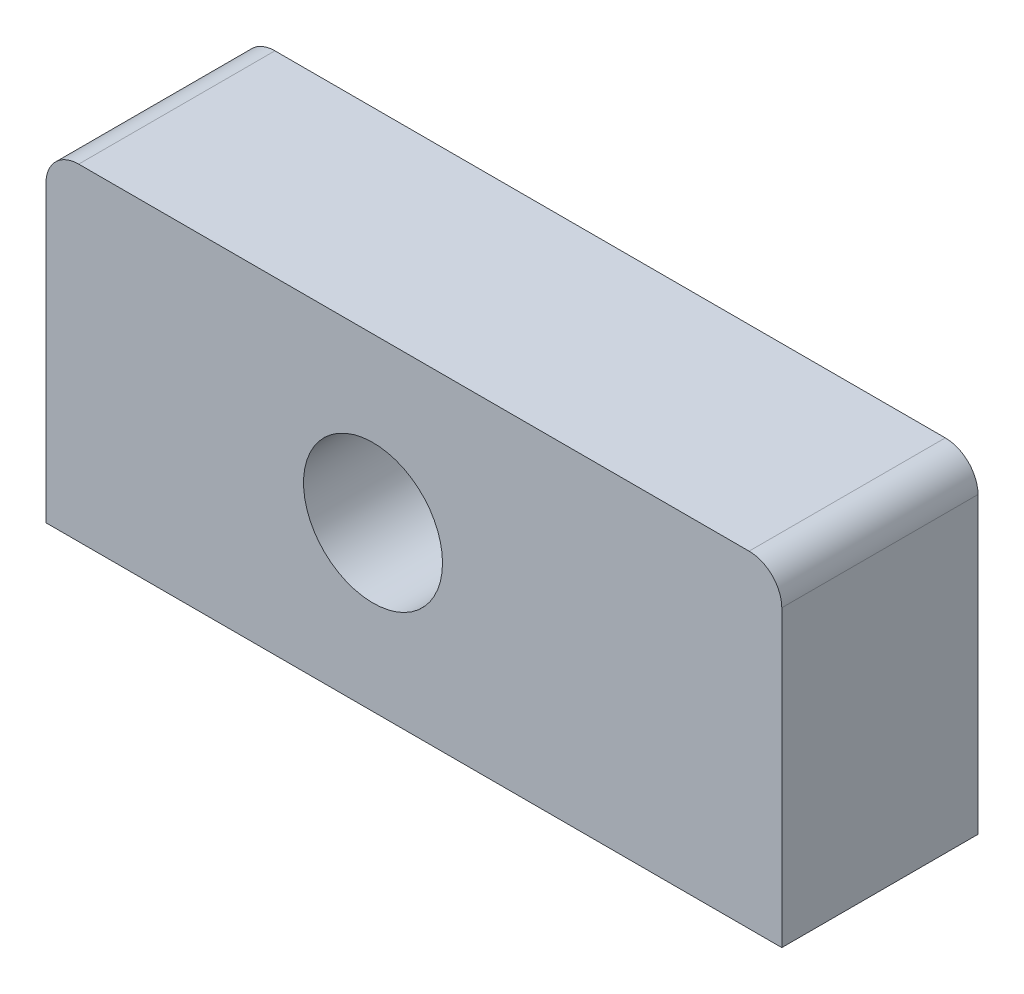
ISO-10303-21;
HEADER;
FILE_DESCRIPTION(('STEP AP214'),'2;1');
FILE_NAME('part.step','',(''),(''),'','','');
FILE_SCHEMA(('AUTOMOTIVE_DESIGN { 1 0 10303 214 1 1 1 1 }'));
ENDSEC;
DATA;
#1=APPLICATION_CONTEXT('core data for automotive mechanical design processes');
#2=APPLICATION_PROTOCOL_DEFINITION('international standard','automotive_design',2000,#1);
#3=PRODUCT_CONTEXT('',#1,'mechanical');
#4=PRODUCT('Part','Part','',(#3));
#5=PRODUCT_RELATED_PRODUCT_CATEGORY('part','',(#4));
#6=PRODUCT_DEFINITION_FORMATION('','',#4);
#7=PRODUCT_DEFINITION_CONTEXT('part definition',#1,'design');
#8=PRODUCT_DEFINITION('design','',#6,#7);
#9=PRODUCT_DEFINITION_SHAPE('','',#8);
#10=(LENGTH_UNIT() NAMED_UNIT(*) SI_UNIT(.MILLI.,.METRE.));
#11=(NAMED_UNIT(*) PLANE_ANGLE_UNIT() SI_UNIT($,.RADIAN.));
#12=(NAMED_UNIT(*) SI_UNIT($,.STERADIAN.) SOLID_ANGLE_UNIT());
#13=UNCERTAINTY_MEASURE_WITH_UNIT(LENGTH_MEASURE(1.E-05),#10,'distance_accuracy_value','');
#14=(GEOMETRIC_REPRESENTATION_CONTEXT(3) GLOBAL_UNCERTAINTY_ASSIGNED_CONTEXT((#13)) GLOBAL_UNIT_ASSIGNED_CONTEXT((#10,
#11,#12)) REPRESENTATION_CONTEXT('',''));
#15=CARTESIAN_POINT('',(0.,0.,0.));
#16=DIRECTION('',(0.,0.,1.));
#17=DIRECTION('',(1.,0.,0.));
#18=AXIS2_PLACEMENT_3D('',#15,#16,#17);
#19=CARTESIAN_POINT('',(0.,0.,12.));
#20=DIRECTION('',(0.,0.,-1.));
#21=DIRECTION('',(-1.,0.,0.));
#22=AXIS2_PLACEMENT_3D('',#19,#20,#21);
#23=PLANE('',#22);
#24=DIRECTION('',(0.,1.,0.));
#25=VECTOR('',#24,1.);
#26=CARTESIAN_POINT('',(45.,0.,12.));
#27=LINE('',#26,#25);
#28=CARTESIAN_POINT('',(45.,0.,12.));
#29=VERTEX_POINT('',#28);
#30=CARTESIAN_POINT('',(45.,18.,12.));
#31=VERTEX_POINT('',#30);
#32=EDGE_CURVE('E104',#29,#31,#27,.T.);
#33=ORIENTED_EDGE('',*,*,#32,.T.);
#34=CARTESIAN_POINT('',(43.,18.,12.));
#35=DIRECTION('',(0.,0.,-1.));
#36=DIRECTION('',(-1.,0.,0.));
#37=AXIS2_PLACEMENT_3D('',#34,#35,#36);
#38=CIRCLE('',#37,2.);
#39=CARTESIAN_POINT('',(43.,20.,12.));
#40=VERTEX_POINT('',#39);
#41=EDGE_CURVE('E43',#31,#40,#38,.F.);
#42=ORIENTED_EDGE('',*,*,#41,.T.);
#43=DIRECTION('',(-1.,0.,0.));
#44=VECTOR('',#43,1.);
#45=CARTESIAN_POINT('',(0.,20.,12.));
#46=LINE('',#45,#44);
#47=CARTESIAN_POINT('',(2.,20.,12.));
#48=VERTEX_POINT('',#47);
#49=EDGE_CURVE('E114',#40,#48,#46,.T.);
#50=ORIENTED_EDGE('',*,*,#49,.T.);
#51=CARTESIAN_POINT('',(2.,18.,12.));
#52=DIRECTION('',(0.,0.,-1.));
#53=DIRECTION('',(-1.,0.,0.));
#54=AXIS2_PLACEMENT_3D('',#51,#52,#53);
#55=CIRCLE('',#54,2.);
#56=CARTESIAN_POINT('',(0.,18.,12.));
#57=VERTEX_POINT('',#56);
#58=EDGE_CURVE('E50',#48,#57,#55,.F.);
#59=ORIENTED_EDGE('',*,*,#58,.T.);
#60=DIRECTION('',(0.,-1.,0.));
#61=VECTOR('',#60,1.);
#62=CARTESIAN_POINT('',(0.,0.,12.));
#63=LINE('',#62,#61);
#64=CARTESIAN_POINT('',(0.,0.,12.));
#65=VERTEX_POINT('',#64);
#66=EDGE_CURVE('E88',#57,#65,#63,.T.);
#67=ORIENTED_EDGE('',*,*,#66,.T.);
#68=DIRECTION('',(1.,0.,0.));
#69=VECTOR('',#68,1.);
#70=CARTESIAN_POINT('',(0.,0.,12.));
#71=LINE('',#70,#69);
#72=EDGE_CURVE('E91',#65,#29,#71,.T.);
#73=ORIENTED_EDGE('',*,*,#72,.T.);
#74=EDGE_LOOP('',(#33,#42,#50,#59,#67,#73));
#75=FACE_BOUND('',#74,.T.);
#76=CARTESIAN_POINT('',(20.,10.,12.));
#77=DIRECTION('',(0.,0.,1.));
#78=DIRECTION('',(1.,0.,0.));
#79=AXIS2_PLACEMENT_3D('',#76,#77,#78);
#80=CIRCLE('',#79,4.25);
#81=CARTESIAN_POINT('',(24.25,10.,12.));
#82=VERTEX_POINT('',#81);
#83=EDGE_CURVE('E146',#82,#82,#80,.T.);
#84=ORIENTED_EDGE('',*,*,#83,.F.);
#85=EDGE_LOOP('',(#84));
#86=FACE_BOUND('',#85,.T.);
#87=ADVANCED_FACE('F35',(#75,#86),#23,.F.);
#88=CARTESIAN_POINT('',(0.,0.,0.));
#89=DIRECTION('',(0.,0.,-1.));
#90=DIRECTION('',(-1.,0.,0.));
#91=AXIS2_PLACEMENT_3D('',#88,#89,#90);
#92=PLANE('',#91);
#93=DIRECTION('',(-1.,0.,0.));
#94=VECTOR('',#93,1.);
#95=CARTESIAN_POINT('',(0.,20.,0.));
#96=LINE('',#95,#94);
#97=CARTESIAN_POINT('',(43.,20.,0.));
#98=VERTEX_POINT('',#97);
#99=CARTESIAN_POINT('',(2.,20.,0.));
#100=VERTEX_POINT('',#99);
#101=EDGE_CURVE('E96',#98,#100,#96,.T.);
#102=ORIENTED_EDGE('',*,*,#101,.F.);
#103=CARTESIAN_POINT('',(43.,18.,0.));
#104=DIRECTION('',(0.,0.,-1.));
#105=DIRECTION('',(-1.,0.,0.));
#106=AXIS2_PLACEMENT_3D('',#103,#104,#105);
#107=CIRCLE('',#106,2.);
#108=CARTESIAN_POINT('',(45.,18.,0.));
#109=VERTEX_POINT('',#108);
#110=EDGE_CURVE('E122',#98,#109,#107,.T.);
#111=ORIENTED_EDGE('',*,*,#110,.T.);
#112=DIRECTION('',(0.,1.,0.));
#113=VECTOR('',#112,1.);
#114=CARTESIAN_POINT('',(45.,0.,0.));
#115=LINE('',#114,#113);
#116=CARTESIAN_POINT('',(45.,0.,0.));
#117=VERTEX_POINT('',#116);
#118=EDGE_CURVE('E140',#117,#109,#115,.T.);
#119=ORIENTED_EDGE('',*,*,#118,.F.);
#120=DIRECTION('',(1.,0.,0.));
#121=VECTOR('',#120,1.);
#122=CARTESIAN_POINT('',(0.,0.,0.));
#123=LINE('',#122,#121);
#124=CARTESIAN_POINT('',(0.,0.,0.));
#125=VERTEX_POINT('',#124);
#126=EDGE_CURVE('E142',#125,#117,#123,.T.);
#127=ORIENTED_EDGE('',*,*,#126,.F.);
#128=DIRECTION('',(0.,-1.,0.));
#129=VECTOR('',#128,1.);
#130=CARTESIAN_POINT('',(0.,0.,0.));
#131=LINE('',#130,#129);
#132=CARTESIAN_POINT('',(0.,18.,0.));
#133=VERTEX_POINT('',#132);
#134=EDGE_CURVE('E108',#133,#125,#131,.T.);
#135=ORIENTED_EDGE('',*,*,#134,.F.);
#136=CARTESIAN_POINT('',(2.,18.,0.));
#137=DIRECTION('',(0.,0.,-1.));
#138=DIRECTION('',(-1.,0.,0.));
#139=AXIS2_PLACEMENT_3D('',#136,#137,#138);
#140=CIRCLE('',#139,2.);
#141=EDGE_CURVE('E120',#133,#100,#140,.T.);
#142=ORIENTED_EDGE('',*,*,#141,.T.);
#143=EDGE_LOOP('',(#102,#111,#119,#127,#135,#142));
#144=FACE_BOUND('',#143,.T.);
#145=CARTESIAN_POINT('',(20.,10.,0.));
#146=DIRECTION('',(0.,0.,1.));
#147=DIRECTION('',(1.,0.,0.));
#148=AXIS2_PLACEMENT_3D('',#145,#146,#147);
#149=CIRCLE('',#148,4.25);
#150=CARTESIAN_POINT('',(24.25,10.,0.));
#151=VERTEX_POINT('',#150);
#152=EDGE_CURVE('E149',#151,#151,#149,.T.);
#153=ORIENTED_EDGE('',*,*,#152,.T.);
#154=EDGE_LOOP('',(#153));
#155=FACE_BOUND('',#154,.T.);
#156=ADVANCED_FACE('F138',(#144,#155),#92,.T.);
#157=CARTESIAN_POINT('',(0.,0.,12.));
#158=DIRECTION('',(1.,0.,0.));
#159=DIRECTION('',(0.,0.,-1.));
#160=AXIS2_PLACEMENT_3D('',#157,#158,#159);
#161=PLANE('',#160);
#162=ORIENTED_EDGE('',*,*,#66,.F.);
#163=DIRECTION('',(0.,0.,-1.));
#164=VECTOR('',#163,1.);
#165=CARTESIAN_POINT('',(0.,18.,12.));
#166=LINE('',#165,#164);
#167=EDGE_CURVE('E12',#57,#133,#166,.T.);
#168=ORIENTED_EDGE('',*,*,#167,.T.);
#169=ORIENTED_EDGE('',*,*,#134,.T.);
#170=DIRECTION('',(0.,0.,-1.));
#171=VECTOR('',#170,1.);
#172=CARTESIAN_POINT('',(0.,0.,12.));
#173=LINE('',#172,#171);
#174=EDGE_CURVE('E101',#65,#125,#173,.T.);
#175=ORIENTED_EDGE('',*,*,#174,.F.);
#176=EDGE_LOOP('',(#162,#168,#169,#175));
#177=FACE_BOUND('',#176,.T.);
#178=ADVANCED_FACE('F106',(#177),#161,.F.);
#179=CARTESIAN_POINT('',(0.,0.,12.));
#180=DIRECTION('',(0.,1.,0.));
#181=DIRECTION('',(0.,0.,1.));
#182=AXIS2_PLACEMENT_3D('',#179,#180,#181);
#183=PLANE('',#182);
#184=CARTESIAN_POINT('',(35.,0.,6.));
#185=DIRECTION('',(0.,-1.,0.));
#186=DIRECTION('',(0.,0.,-1.));
#187=AXIS2_PLACEMENT_3D('',#184,#185,#186);
#188=CIRCLE('',#187,1.5);
#189=CARTESIAN_POINT('',(35.,0.,4.5));
#190=VERTEX_POINT('',#189);
#191=EDGE_CURVE('E164',#190,#190,#188,.T.);
#192=ORIENTED_EDGE('',*,*,#191,.F.);
#193=EDGE_LOOP('',(#192));
#194=FACE_BOUND('',#193,.T.);
#195=CARTESIAN_POINT('',(5.,0.,6.));
#196=DIRECTION('',(0.,-1.,0.));
#197=DIRECTION('',(0.,0.,-1.));
#198=AXIS2_PLACEMENT_3D('',#195,#196,#197);
#199=CIRCLE('',#198,1.5);
#200=CARTESIAN_POINT('',(5.,0.,4.5));
#201=VERTEX_POINT('',#200);
#202=EDGE_CURVE('E155',#201,#201,#199,.T.);
#203=ORIENTED_EDGE('',*,*,#202,.F.);
#204=EDGE_LOOP('',(#203));
#205=FACE_BOUND('',#204,.T.);
#206=ORIENTED_EDGE('',*,*,#126,.T.);
#207=DIRECTION('',(0.,0.,-1.));
#208=VECTOR('',#207,1.);
#209=CARTESIAN_POINT('',(45.,0.,12.));
#210=LINE('',#209,#208);
#211=EDGE_CURVE('E103',#29,#117,#210,.T.);
#212=ORIENTED_EDGE('',*,*,#211,.F.);
#213=ORIENTED_EDGE('',*,*,#72,.F.);
#214=ORIENTED_EDGE('',*,*,#174,.T.);
#215=EDGE_LOOP('',(#206,#212,#213,#214));
#216=FACE_BOUND('',#215,.T.);
#217=ADVANCED_FACE('F100',(#194,#205,#216),#183,.F.);
#218=CARTESIAN_POINT('',(45.,0.,12.));
#219=DIRECTION('',(-1.,0.,0.));
#220=DIRECTION('',(0.,0.,1.));
#221=AXIS2_PLACEMENT_3D('',#218,#219,#220);
#222=PLANE('',#221);
#223=ORIENTED_EDGE('',*,*,#118,.T.);
#224=DIRECTION('',(0.,0.,-1.));
#225=VECTOR('',#224,1.);
#226=CARTESIAN_POINT('',(45.,18.,12.));
#227=LINE('',#226,#225);
#228=EDGE_CURVE('E58',#109,#31,#227,.F.);
#229=ORIENTED_EDGE('',*,*,#228,.T.);
#230=ORIENTED_EDGE('',*,*,#32,.F.);
#231=ORIENTED_EDGE('',*,*,#211,.T.);
#232=EDGE_LOOP('',(#223,#229,#230,#231));
#233=FACE_BOUND('',#232,.T.);
#234=ADVANCED_FACE('F141',(#233),#222,.F.);
#235=CARTESIAN_POINT('',(0.,20.,12.));
#236=DIRECTION('',(0.,-1.,0.));
#237=DIRECTION('',(0.,0.,-1.));
#238=AXIS2_PLACEMENT_3D('',#235,#236,#237);
#239=PLANE('',#238);
#240=ORIENTED_EDGE('',*,*,#49,.F.);
#241=DIRECTION('',(0.,0.,-1.));
#242=VECTOR('',#241,1.);
#243=CARTESIAN_POINT('',(43.,20.,12.));
#244=LINE('',#243,#242);
#245=EDGE_CURVE('E112',#40,#98,#244,.T.);
#246=ORIENTED_EDGE('',*,*,#245,.T.);
#247=ORIENTED_EDGE('',*,*,#101,.T.);
#248=DIRECTION('',(0.,0.,-1.));
#249=VECTOR('',#248,1.);
#250=CARTESIAN_POINT('',(2.,20.,12.));
#251=LINE('',#250,#249);
#252=EDGE_CURVE('E110',#100,#48,#251,.F.);
#253=ORIENTED_EDGE('',*,*,#252,.T.);
#254=EDGE_LOOP('',(#240,#246,#247,#253));
#255=FACE_BOUND('',#254,.T.);
#256=ADVANCED_FACE('F130',(#255),#239,.F.);
#257=CARTESIAN_POINT('',(20.,10.,12.));
#258=DIRECTION('',(0.,0.,-1.));
#259=DIRECTION('',(-1.,0.,0.));
#260=AXIS2_PLACEMENT_3D('',#257,#258,#259);
#261=CYLINDRICAL_SURFACE('',#260,4.25);
#262=ORIENTED_EDGE('',*,*,#83,.T.);
#263=EDGE_LOOP('',(#262));
#264=FACE_BOUND('',#263,.T.);
#265=ORIENTED_EDGE('',*,*,#152,.F.);
#266=EDGE_LOOP('',(#265));
#267=FACE_BOUND('',#266,.T.);
#268=ADVANCED_FACE('F203',(#264,#267),#261,.F.);
#269=CARTESIAN_POINT('',(43.,18.,12.));
#270=DIRECTION('',(0.,0.,-1.));
#271=DIRECTION('',(-1.,0.,0.));
#272=AXIS2_PLACEMENT_3D('',#269,#270,#271);
#273=CYLINDRICAL_SURFACE('',#272,2.);
#274=ORIENTED_EDGE('',*,*,#41,.F.);
#275=ORIENTED_EDGE('',*,*,#228,.F.);
#276=ORIENTED_EDGE('',*,*,#110,.F.);
#277=ORIENTED_EDGE('',*,*,#245,.F.);
#278=EDGE_LOOP('',(#274,#275,#276,#277));
#279=FACE_BOUND('',#278,.T.);
#280=ADVANCED_FACE('F135',(#279),#273,.T.);
#281=CARTESIAN_POINT('',(2.,18.,12.));
#282=DIRECTION('',(0.,0.,-1.));
#283=DIRECTION('',(-1.,0.,0.));
#284=AXIS2_PLACEMENT_3D('',#281,#282,#283);
#285=CYLINDRICAL_SURFACE('',#284,2.);
#286=ORIENTED_EDGE('',*,*,#58,.F.);
#287=ORIENTED_EDGE('',*,*,#252,.F.);
#288=ORIENTED_EDGE('',*,*,#141,.F.);
#289=ORIENTED_EDGE('',*,*,#167,.F.);
#290=EDGE_LOOP('',(#286,#287,#288,#289));
#291=FACE_BOUND('',#290,.T.);
#292=ADVANCED_FACE('F37',(#291),#285,.T.);
#293=CARTESIAN_POINT('',(5.,5.,6.));
#294=DIRECTION('',(0.,-1.,0.));
#295=DIRECTION('',(0.,0.,-1.));
#296=AXIS2_PLACEMENT_3D('',#293,#294,#295);
#297=CYLINDRICAL_SURFACE('',#296,1.5);
#298=CARTESIAN_POINT('',(5.,5.,6.));
#299=DIRECTION('',(0.,-1.,0.));
#300=DIRECTION('',(0.,0.,-1.));
#301=AXIS2_PLACEMENT_3D('',#298,#299,#300);
#302=CIRCLE('',#301,1.5);
#303=CARTESIAN_POINT('',(5.,5.,4.5));
#304=VERTEX_POINT('',#303);
#305=EDGE_CURVE('E151',#304,#304,#302,.T.);
#306=ORIENTED_EDGE('',*,*,#305,.F.);
#307=EDGE_LOOP('',(#306));
#308=FACE_BOUND('',#307,.T.);
#309=ORIENTED_EDGE('',*,*,#202,.T.);
#310=EDGE_LOOP('',(#309));
#311=FACE_BOUND('',#310,.T.);
#312=ADVANCED_FACE('F184',(#308,#311),#297,.F.);
#313=CARTESIAN_POINT('',(5.,5.,6.));
#314=DIRECTION('',(0.,-1.,0.));
#315=DIRECTION('',(0.,0.,-1.));
#316=AXIS2_PLACEMENT_3D('',#313,#314,#315);
#317=PLANE('',#316);
#318=ORIENTED_EDGE('',*,*,#305,.T.);
#319=EDGE_LOOP('',(#318));
#320=FACE_BOUND('',#319,.T.);
#321=ADVANCED_FACE('F175',(#320),#317,.T.);
#322=CARTESIAN_POINT('',(35.,5.,6.));
#323=DIRECTION('',(0.,-1.,0.));
#324=DIRECTION('',(0.,0.,-1.));
#325=AXIS2_PLACEMENT_3D('',#322,#323,#324);
#326=CYLINDRICAL_SURFACE('',#325,1.5);
#327=CARTESIAN_POINT('',(35.,5.,6.));
#328=DIRECTION('',(0.,-1.,0.));
#329=DIRECTION('',(0.,0.,-1.));
#330=AXIS2_PLACEMENT_3D('',#327,#328,#329);
#331=CIRCLE('',#330,1.5);
#332=CARTESIAN_POINT('',(35.,5.,4.5));
#333=VERTEX_POINT('',#332);
#334=EDGE_CURVE('E161',#333,#333,#331,.T.);
#335=ORIENTED_EDGE('',*,*,#334,.F.);
#336=EDGE_LOOP('',(#335));
#337=FACE_BOUND('',#336,.T.);
#338=ORIENTED_EDGE('',*,*,#191,.T.);
#339=EDGE_LOOP('',(#338));
#340=FACE_BOUND('',#339,.T.);
#341=ADVANCED_FACE('F172',(#337,#340),#326,.F.);
#342=CARTESIAN_POINT('',(35.,5.,6.));
#343=DIRECTION('',(0.,-1.,0.));
#344=DIRECTION('',(0.,0.,-1.));
#345=AXIS2_PLACEMENT_3D('',#342,#343,#344);
#346=PLANE('',#345);
#347=ORIENTED_EDGE('',*,*,#334,.T.);
#348=EDGE_LOOP('',(#347));
#349=FACE_BOUND('',#348,.T.);
#350=ADVANCED_FACE('F170',(#349),#346,.T.);
#351=CLOSED_SHELL('',(#87,#156,#178,#217,#234,#256,#268,#280,#292,#312,#321,#341,#350));
#352=MANIFOLD_SOLID_BREP('B2',#351);
#353=ADVANCED_BREP_SHAPE_REPRESENTATION('',(#18,#352),#14);
#354=SHAPE_DEFINITION_REPRESENTATION(#9,#353);
ENDSEC;
END-ISO-10303-21;
